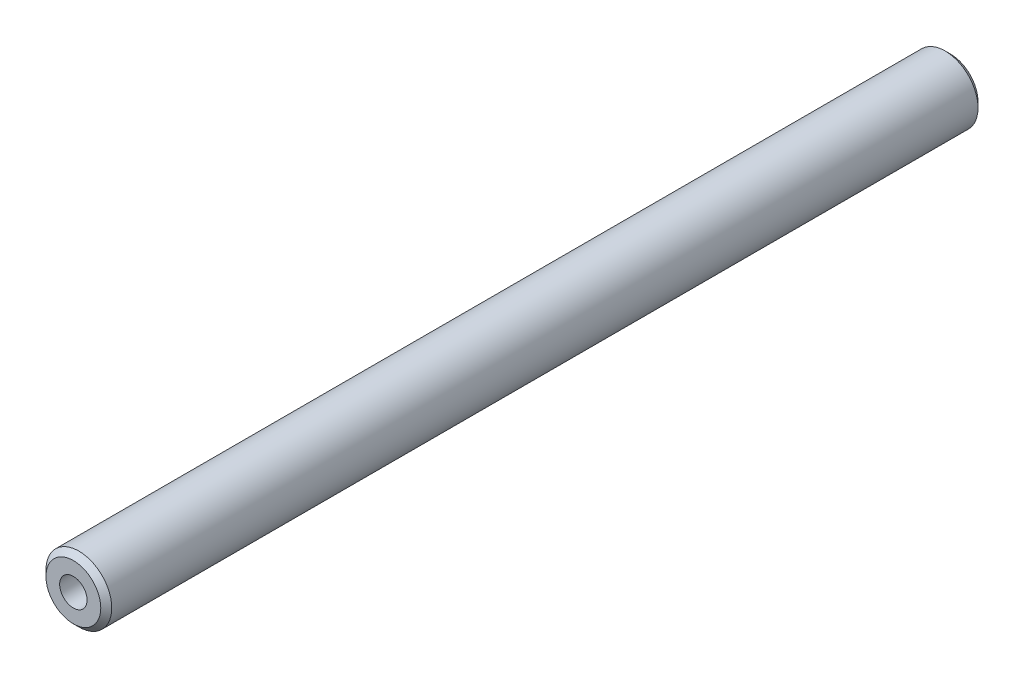
ISO-10303-21;
HEADER;
FILE_DESCRIPTION(('STEP AP214'),'2;1');
FILE_NAME('part.step','',(''),(''),'','','');
FILE_SCHEMA(('AUTOMOTIVE_DESIGN { 1 0 10303 214 1 1 1 1 }'));
ENDSEC;
DATA;
#1=APPLICATION_CONTEXT('core data for automotive mechanical design processes');
#2=APPLICATION_PROTOCOL_DEFINITION('international standard','automotive_design',2000,#1);
#3=PRODUCT_CONTEXT('',#1,'mechanical');
#4=PRODUCT('Part','Part','',(#3));
#5=PRODUCT_RELATED_PRODUCT_CATEGORY('part','',(#4));
#6=PRODUCT_DEFINITION_FORMATION('','',#4);
#7=PRODUCT_DEFINITION_CONTEXT('part definition',#1,'design');
#8=PRODUCT_DEFINITION('design','',#6,#7);
#9=PRODUCT_DEFINITION_SHAPE('','',#8);
#10=(LENGTH_UNIT() NAMED_UNIT(*) SI_UNIT(.MILLI.,.METRE.));
#11=(NAMED_UNIT(*) PLANE_ANGLE_UNIT() SI_UNIT($,.RADIAN.));
#12=(NAMED_UNIT(*) SI_UNIT($,.STERADIAN.) SOLID_ANGLE_UNIT());
#13=UNCERTAINTY_MEASURE_WITH_UNIT(LENGTH_MEASURE(1.E-05),#10,'distance_accuracy_value','');
#14=(GEOMETRIC_REPRESENTATION_CONTEXT(3) GLOBAL_UNCERTAINTY_ASSIGNED_CONTEXT((#13)) GLOBAL_UNIT_ASSIGNED_CONTEXT((#10,
#11,#12)) REPRESENTATION_CONTEXT('',''));
#15=CARTESIAN_POINT('',(0.,0.,0.));
#16=DIRECTION('',(0.,0.,1.));
#17=DIRECTION('',(1.,0.,0.));
#18=AXIS2_PLACEMENT_3D('',#15,#16,#17);
#19=CARTESIAN_POINT('',(0.,0.,40.));
#20=DIRECTION('',(0.,0.,-1.));
#21=DIRECTION('',(-1.,0.,0.));
#22=AXIS2_PLACEMENT_3D('',#19,#20,#21);
#23=CYLINDRICAL_SURFACE('',#22,3.);
#24=CARTESIAN_POINT('',(0.,0.,-39.5));
#25=DIRECTION('',(0.,0.,1.));
#26=DIRECTION('',(1.,0.,0.));
#27=AXIS2_PLACEMENT_3D('',#24,#25,#26);
#28=CIRCLE('',#27,3.);
#29=CARTESIAN_POINT('',(3.,0.,-39.5));
#30=VERTEX_POINT('',#29);
#31=EDGE_CURVE('E91',#30,#30,#28,.T.);
#32=ORIENTED_EDGE('',*,*,#31,.T.);
#33=EDGE_LOOP('',(#32));
#34=FACE_BOUND('',#33,.T.);
#35=CARTESIAN_POINT('',(0.,0.,39.5));
#36=DIRECTION('',(0.,0.,1.));
#37=DIRECTION('',(1.,0.,0.));
#38=AXIS2_PLACEMENT_3D('',#35,#36,#37);
#39=CIRCLE('',#38,3.);
#40=CARTESIAN_POINT('',(3.,0.,39.5));
#41=VERTEX_POINT('',#40);
#42=EDGE_CURVE('E87',#41,#41,#39,.F.);
#43=ORIENTED_EDGE('',*,*,#42,.T.);
#44=EDGE_LOOP('',(#43));
#45=FACE_BOUND('',#44,.T.);
#46=ADVANCED_FACE('F46',(#34,#45),#23,.T.);
#47=CARTESIAN_POINT('',(0.,0.,40.));
#48=DIRECTION('',(0.,0.,1.));
#49=DIRECTION('',(1.,0.,0.));
#50=AXIS2_PLACEMENT_3D('',#47,#48,#49);
#51=PLANE('',#50);
#52=CARTESIAN_POINT('',(0.,0.,40.));
#53=DIRECTION('',(0.,0.,1.));
#54=DIRECTION('',(1.,0.,0.));
#55=AXIS2_PLACEMENT_3D('',#52,#53,#54);
#56=CIRCLE('',#55,1.24999999999999);
#57=CARTESIAN_POINT('',(1.24999999999999,0.,40.));
#58=VERTEX_POINT('',#57);
#59=EDGE_CURVE('E72',#58,#58,#56,.T.);
#60=ORIENTED_EDGE('',*,*,#59,.F.);
#61=EDGE_LOOP('',(#60));
#62=FACE_BOUND('',#61,.T.);
#63=CARTESIAN_POINT('',(0.,0.,40.));
#64=DIRECTION('',(0.,0.,1.));
#65=DIRECTION('',(1.,0.,0.));
#66=AXIS2_PLACEMENT_3D('',#63,#64,#65);
#67=CIRCLE('',#66,2.5);
#68=CARTESIAN_POINT('',(2.5,0.,40.));
#69=VERTEX_POINT('',#68);
#70=EDGE_CURVE('E11',#69,#69,#67,.T.);
#71=ORIENTED_EDGE('',*,*,#70,.T.);
#72=EDGE_LOOP('',(#71));
#73=FACE_BOUND('',#72,.T.);
#74=ADVANCED_FACE('F108',(#62,#73),#51,.T.);
#75=CARTESIAN_POINT('',(0.,0.,-40.));
#76=DIRECTION('',(0.,0.,1.));
#77=DIRECTION('',(1.,0.,0.));
#78=AXIS2_PLACEMENT_3D('',#75,#76,#77);
#79=PLANE('',#78);
#80=CARTESIAN_POINT('',(0.,0.,-40.));
#81=DIRECTION('',(0.,0.,-1.));
#82=DIRECTION('',(-1.,0.,0.));
#83=AXIS2_PLACEMENT_3D('',#80,#81,#82);
#84=CIRCLE('',#83,1.24999999999999);
#85=CARTESIAN_POINT('',(-1.24999999999999,0.,-40.));
#86=VERTEX_POINT('',#85);
#87=EDGE_CURVE('E73',#86,#86,#84,.T.);
#88=ORIENTED_EDGE('',*,*,#87,.F.);
#89=EDGE_LOOP('',(#88));
#90=FACE_BOUND('',#89,.T.);
#91=CARTESIAN_POINT('',(0.,0.,-40.));
#92=DIRECTION('',(0.,0.,1.));
#93=DIRECTION('',(1.,0.,0.));
#94=AXIS2_PLACEMENT_3D('',#91,#92,#93);
#95=CIRCLE('',#94,2.50000000000001);
#96=CARTESIAN_POINT('',(2.50000000000001,0.,-40.));
#97=VERTEX_POINT('',#96);
#98=EDGE_CURVE('E55',#97,#97,#95,.F.);
#99=ORIENTED_EDGE('',*,*,#98,.T.);
#100=EDGE_LOOP('',(#99));
#101=FACE_BOUND('',#100,.T.);
#102=ADVANCED_FACE('F99',(#90,#101),#79,.F.);
#103=CARTESIAN_POINT('',(0.,0.,-39.5));
#104=DIRECTION('',(0.,0.,1.));
#105=DIRECTION('',(1.,0.,0.));
#106=AXIS2_PLACEMENT_3D('',#103,#104,#105);
#107=CONICAL_SURFACE('',#106,3.,0.785398163397453);
#108=ORIENTED_EDGE('',*,*,#98,.F.);
#109=EDGE_LOOP('',(#108));
#110=FACE_BOUND('',#109,.T.);
#111=ORIENTED_EDGE('',*,*,#31,.F.);
#112=EDGE_LOOP('',(#111));
#113=FACE_BOUND('',#112,.T.);
#114=ADVANCED_FACE('F101',(#110,#113),#107,.T.);
#115=CARTESIAN_POINT('',(0.,0.,40.));
#116=DIRECTION('',(0.,0.,-1.));
#117=DIRECTION('',(-1.,0.,0.));
#118=AXIS2_PLACEMENT_3D('',#115,#116,#117);
#119=CONICAL_SURFACE('',#118,2.5,0.785398163397446);
#120=ORIENTED_EDGE('',*,*,#42,.F.);
#121=EDGE_LOOP('',(#120));
#122=FACE_BOUND('',#121,.T.);
#123=ORIENTED_EDGE('',*,*,#70,.F.);
#124=EDGE_LOOP('',(#123));
#125=FACE_BOUND('',#124,.T.);
#126=ADVANCED_FACE('F48',(#122,#125),#119,.T.);
#127=CARTESIAN_POINT('',(0.,0.,31.5));
#128=DIRECTION('',(0.,0.,1.));
#129=DIRECTION('',(1.,0.,0.));
#130=AXIS2_PLACEMENT_3D('',#127,#128,#129);
#131=CONICAL_SURFACE('',#130,1.24999999999999,1.02974425867665);
#132=CARTESIAN_POINT('',(0.,0.,30.7489242262155));
#133=VERTEX_POINT('',#132);
#134=VERTEX_LOOP('',#133);
#135=FACE_BOUND('',#134,.T.);
#136=CARTESIAN_POINT('',(0.,0.,31.5));
#137=DIRECTION('',(0.,0.,1.));
#138=DIRECTION('',(1.,0.,0.));
#139=AXIS2_PLACEMENT_3D('',#136,#137,#138);
#140=CIRCLE('',#139,1.24999999999999);
#141=CARTESIAN_POINT('',(1.24999999999999,0.,31.5));
#142=VERTEX_POINT('',#141);
#143=EDGE_CURVE('E79',#142,#142,#140,.T.);
#144=ORIENTED_EDGE('',*,*,#143,.T.);
#145=EDGE_LOOP('',(#144));
#146=FACE_BOUND('',#145,.T.);
#147=ADVANCED_FACE('F114',(#135,#146),#131,.F.);
#148=CARTESIAN_POINT('',(0.,0.,40.));
#149=DIRECTION('',(0.,0.,1.));
#150=DIRECTION('',(1.,0.,0.));
#151=AXIS2_PLACEMENT_3D('',#148,#149,#150);
#152=CYLINDRICAL_SURFACE('',#151,1.24999999999999);
#153=ORIENTED_EDGE('',*,*,#143,.F.);
#154=EDGE_LOOP('',(#153));
#155=FACE_BOUND('',#154,.T.);
#156=ORIENTED_EDGE('',*,*,#59,.T.);
#157=EDGE_LOOP('',(#156));
#158=FACE_BOUND('',#157,.T.);
#159=ADVANCED_FACE('F65',(#155,#158),#152,.F.);
#160=CARTESIAN_POINT('',(0.,0.,-31.5));
#161=DIRECTION('',(0.,0.,-1.));
#162=DIRECTION('',(-1.,0.,0.));
#163=AXIS2_PLACEMENT_3D('',#160,#161,#162);
#164=CONICAL_SURFACE('',#163,1.24999999999999,1.02974425867665);
#165=CARTESIAN_POINT('',(0.,0.,-30.7489242262155));
#166=VERTEX_POINT('',#165);
#167=VERTEX_LOOP('',#166);
#168=FACE_BOUND('',#167,.T.);
#169=CARTESIAN_POINT('',(0.,0.,-31.5));
#170=DIRECTION('',(0.,0.,-1.));
#171=DIRECTION('',(-1.,0.,0.));
#172=AXIS2_PLACEMENT_3D('',#169,#170,#171);
#173=CIRCLE('',#172,1.24999999999999);
#174=CARTESIAN_POINT('',(-1.24999999999999,0.,-31.5));
#175=VERTEX_POINT('',#174);
#176=EDGE_CURVE('E69',#175,#175,#173,.T.);
#177=ORIENTED_EDGE('',*,*,#176,.T.);
#178=EDGE_LOOP('',(#177));
#179=FACE_BOUND('',#178,.T.);
#180=ADVANCED_FACE('F61',(#168,#179),#164,.F.);
#181=CARTESIAN_POINT('',(0.,0.,-40.));
#182=DIRECTION('',(0.,0.,-1.));
#183=DIRECTION('',(-1.,0.,0.));
#184=AXIS2_PLACEMENT_3D('',#181,#182,#183);
#185=CYLINDRICAL_SURFACE('',#184,1.24999999999999);
#186=ORIENTED_EDGE('',*,*,#176,.F.);
#187=EDGE_LOOP('',(#186));
#188=FACE_BOUND('',#187,.T.);
#189=ORIENTED_EDGE('',*,*,#87,.T.);
#190=EDGE_LOOP('',(#189));
#191=FACE_BOUND('',#190,.T.);
#192=ADVANCED_FACE('F64',(#188,#191),#185,.F.);
#193=CLOSED_SHELL('',(#46,#74,#102,#114,#126,#147,#159,#180,#192));
#194=MANIFOLD_SOLID_BREP('B2',#193);
#195=ADVANCED_BREP_SHAPE_REPRESENTATION('',(#18,#194),#14);
#196=SHAPE_DEFINITION_REPRESENTATION(#9,#195);
ENDSEC;
END-ISO-10303-21;
